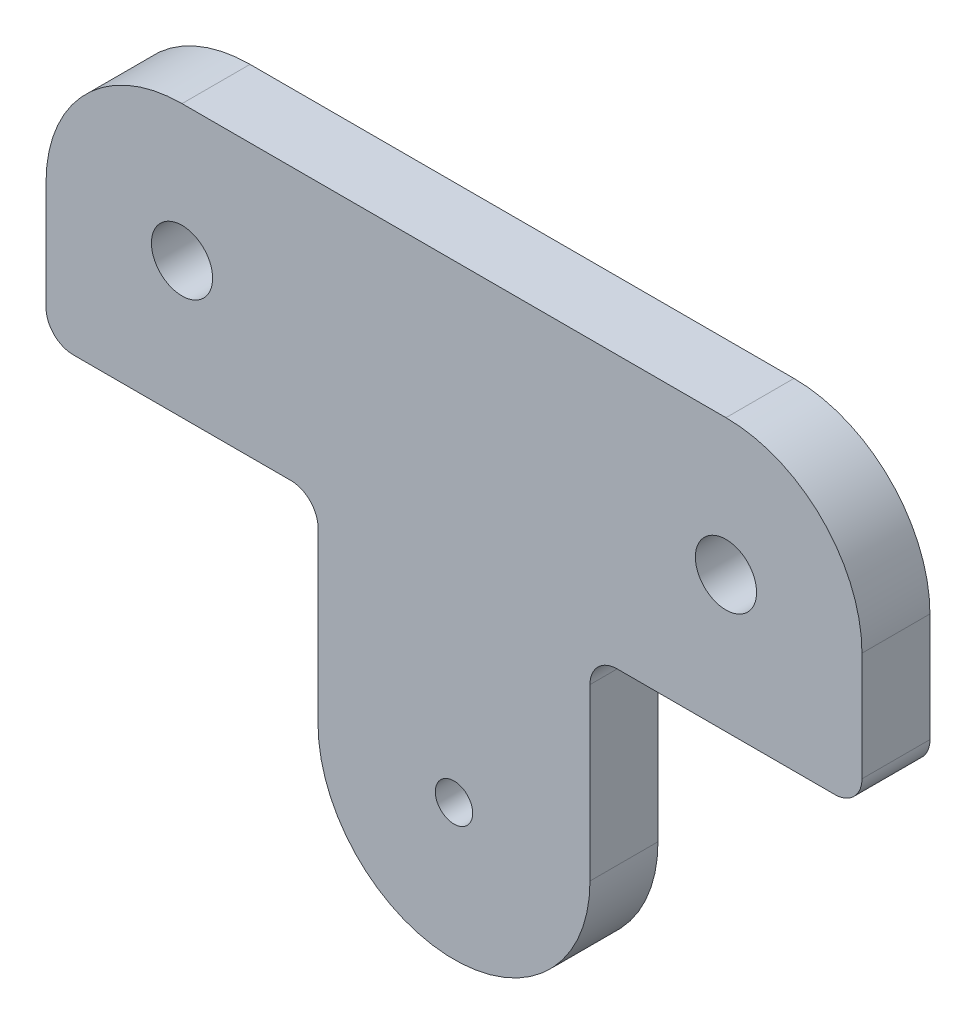
ISO-10303-21;
HEADER;
FILE_DESCRIPTION(('STEP AP214'),'2;1');
FILE_NAME('part.step','',(''),(''),'','','');
FILE_SCHEMA(('AUTOMOTIVE_DESIGN { 1 0 10303 214 1 1 1 1 }'));
ENDSEC;
DATA;
#1=APPLICATION_CONTEXT('core data for automotive mechanical design processes');
#2=APPLICATION_PROTOCOL_DEFINITION('international standard','automotive_design',2000,#1);
#3=PRODUCT_CONTEXT('',#1,'mechanical');
#4=PRODUCT('Part','Part','',(#3));
#5=PRODUCT_RELATED_PRODUCT_CATEGORY('part','',(#4));
#6=PRODUCT_DEFINITION_FORMATION('','',#4);
#7=PRODUCT_DEFINITION_CONTEXT('part definition',#1,'design');
#8=PRODUCT_DEFINITION('design','',#6,#7);
#9=PRODUCT_DEFINITION_SHAPE('','',#8);
#10=(LENGTH_UNIT() NAMED_UNIT(*) SI_UNIT(.MILLI.,.METRE.));
#11=(NAMED_UNIT(*) PLANE_ANGLE_UNIT() SI_UNIT($,.RADIAN.));
#12=(NAMED_UNIT(*) SI_UNIT($,.STERADIAN.) SOLID_ANGLE_UNIT());
#13=UNCERTAINTY_MEASURE_WITH_UNIT(LENGTH_MEASURE(1.E-05),#10,'distance_accuracy_value','');
#14=(GEOMETRIC_REPRESENTATION_CONTEXT(3) GLOBAL_UNCERTAINTY_ASSIGNED_CONTEXT((#13)) GLOBAL_UNIT_ASSIGNED_CONTEXT((#10,
#11,#12)) REPRESENTATION_CONTEXT('',''));
#15=CARTESIAN_POINT('',(0.,0.,0.));
#16=DIRECTION('',(0.,0.,1.));
#17=DIRECTION('',(1.,0.,0.));
#18=AXIS2_PLACEMENT_3D('',#15,#16,#17);
#19=CARTESIAN_POINT('',(26.9198066145719,-1.52399999999972,2.53999999999999));
#20=DIRECTION('',(0.,0.,-0.999999999999999));
#21=DIRECTION('',(-1.,0.,0.));
#22=AXIS2_PLACEMENT_3D('',#19,#20,#21);
#23=PLANE('',#22);
#24=CARTESIAN_POINT('',(26.9198066145719,-1.52399999999972,2.53999999999999));
#25=DIRECTION('',(0.,0.,0.999999999999999));
#26=DIRECTION('',(-1.,0.,0.));
#27=AXIS2_PLACEMENT_3D('',#24,#25,#26);
#28=CIRCLE('',#27,1.016);
#29=CARTESIAN_POINT('',(26.9198066145719,-2.53999999999971,2.53999999999993));
#30=VERTEX_POINT('',#29);
#31=CARTESIAN_POINT('',(27.9358066145719,-1.52399999999975,2.53999999999982));
#32=VERTEX_POINT('',#31);
#33=EDGE_CURVE('E198',#30,#32,#28,.T.);
#34=ORIENTED_EDGE('',*,*,#33,.T.);
#35=DIRECTION('',(0.,0.999999999999996,0.));
#36=VECTOR('',#35,1.);
#37=CARTESIAN_POINT('',(27.935806614572,2.54000000000032,2.5399999999999));
#38=LINE('',#37,#36);
#39=CARTESIAN_POINT('',(27.935806614572,2.54000000000032,2.5399999999999));
#40=VERTEX_POINT('',#39);
#41=EDGE_CURVE('E116',#32,#40,#38,.T.);
#42=ORIENTED_EDGE('',*,*,#41,.T.);
#43=CARTESIAN_POINT('',(22.8558066145719,2.54000000000026,2.53999999999999));
#44=DIRECTION('',(0.,0.,0.999999999999999));
#45=DIRECTION('',(-1.,0.,0.));
#46=AXIS2_PLACEMENT_3D('',#43,#44,#45);
#47=CIRCLE('',#46,5.08);
#48=CARTESIAN_POINT('',(22.8558066145719,7.62000000000029,2.53999999999996));
#49=VERTEX_POINT('',#48);
#50=EDGE_CURVE('E231',#40,#49,#47,.T.);
#51=ORIENTED_EDGE('',*,*,#50,.T.);
#52=DIRECTION('',(-1.,0.,0.));
#53=VECTOR('',#52,1.);
#54=CARTESIAN_POINT('',(2.53580661457181,7.62000000000029,2.54000000000007));
#55=LINE('',#54,#53);
#56=CARTESIAN_POINT('',(2.53580661457181,7.62000000000029,2.54000000000007));
#57=VERTEX_POINT('',#56);
#58=EDGE_CURVE('E250',#49,#57,#55,.T.);
#59=ORIENTED_EDGE('',*,*,#58,.T.);
#60=CARTESIAN_POINT('',(2.53580661457181,2.54000000000029,2.54000000000001));
#61=DIRECTION('',(0.,0.,0.999999999999999));
#62=DIRECTION('',(-1.,0.,0.));
#63=AXIS2_PLACEMENT_3D('',#60,#61,#62);
#64=CIRCLE('',#63,5.08);
#65=CARTESIAN_POINT('',(-2.54419338542822,2.54000000000026,2.53999999999999));
#66=VERTEX_POINT('',#65);
#67=EDGE_CURVE('E247',#57,#66,#64,.T.);
#68=ORIENTED_EDGE('',*,*,#67,.T.);
#69=DIRECTION('',(0.,-0.999999999999996,0.));
#70=VECTOR('',#69,1.);
#71=CARTESIAN_POINT('',(-2.54419338542822,2.54000000000026,2.53999999999999));
#72=LINE('',#71,#70);
#73=CARTESIAN_POINT('',(-2.54419338542826,-1.52399999999972,2.53999999999996));
#74=VERTEX_POINT('',#73);
#75=EDGE_CURVE('E249',#66,#74,#72,.T.);
#76=ORIENTED_EDGE('',*,*,#75,.T.);
#77=CARTESIAN_POINT('',(-1.52819338542826,-1.52399999999972,2.54000000000001));
#78=DIRECTION('',(0.,0.,0.999999999999999));
#79=DIRECTION('',(1.,0.,0.));
#80=AXIS2_PLACEMENT_3D('',#77,#78,#79);
#81=CIRCLE('',#80,1.016);
#82=CARTESIAN_POINT('',(-1.52819338542826,-2.53999999999993,2.54000000000013));
#83=VERTEX_POINT('',#82);
#84=EDGE_CURVE('E252',#74,#83,#81,.T.);
#85=ORIENTED_EDGE('',*,*,#84,.T.);
#86=DIRECTION('',(1.,0.,0.));
#87=VECTOR('',#86,1.);
#88=CARTESIAN_POINT('',(-1.52819338542826,-2.53999999999993,2.54000000000013));
#89=LINE('',#88,#87);
#90=CARTESIAN_POINT('',(6.59980661457166,-2.53999999999976,2.54000000000013));
#91=VERTEX_POINT('',#90);
#92=EDGE_CURVE('E258',#83,#91,#89,.T.);
#93=ORIENTED_EDGE('',*,*,#92,.T.);
#94=CARTESIAN_POINT('',(6.59980661457173,-3.55599999999973,2.54000000000013));
#95=DIRECTION('',(0.,0.,-0.999999999999999));
#96=DIRECTION('',(-1.,0.,0.));
#97=AXIS2_PLACEMENT_3D('',#94,#95,#96);
#98=CIRCLE('',#97,1.016);
#99=CARTESIAN_POINT('',(7.61580661457174,-3.55599999999981,2.53999999999993));
#100=VERTEX_POINT('',#99);
#101=EDGE_CURVE('E260',#91,#100,#98,.T.);
#102=ORIENTED_EDGE('',*,*,#101,.T.);
#103=DIRECTION('',(0.,-0.999999999999996,0.));
#104=VECTOR('',#103,1.);
#105=CARTESIAN_POINT('',(7.61580661457174,-3.55599999999981,2.53999999999993));
#106=LINE('',#105,#104);
#107=CARTESIAN_POINT('',(7.61580661457166,-9.90999999999961,2.54000000000007));
#108=VERTEX_POINT('',#107);
#109=EDGE_CURVE('E262',#100,#108,#106,.T.);
#110=ORIENTED_EDGE('',*,*,#109,.T.);
#111=CARTESIAN_POINT('',(12.6958066145717,-9.90999999999961,2.54000000000015));
#112=DIRECTION('',(0.,0.,0.999999999999999));
#113=DIRECTION('',(1.,0.,0.));
#114=AXIS2_PLACEMENT_3D('',#111,#112,#113);
#115=CIRCLE('',#114,5.08);
#116=CARTESIAN_POINT('',(17.7758066145717,-9.90999999999939,2.53999999999999));
#117=VERTEX_POINT('',#116);
#118=EDGE_CURVE('E153',#108,#117,#115,.T.);
#119=ORIENTED_EDGE('',*,*,#118,.T.);
#120=DIRECTION('',(0.,0.999999999999996,0.));
#121=VECTOR('',#120,1.);
#122=CARTESIAN_POINT('',(17.7758066145717,-3.55599999999973,2.5400000000001));
#123=LINE('',#122,#121);
#124=CARTESIAN_POINT('',(17.7758066145717,-3.55599999999973,2.5400000000001));
#125=VERTEX_POINT('',#124);
#126=EDGE_CURVE('E147',#117,#125,#123,.T.);
#127=ORIENTED_EDGE('',*,*,#126,.T.);
#128=CARTESIAN_POINT('',(18.7918066145717,-3.55599999999973,2.54000000000015));
#129=DIRECTION('',(0.,0.,-0.999999999999999));
#130=DIRECTION('',(1.,0.,0.));
#131=AXIS2_PLACEMENT_3D('',#128,#129,#130);
#132=CIRCLE('',#131,1.016);
#133=CARTESIAN_POINT('',(18.7918066145717,-2.53999999999985,2.54000000000013));
#134=VERTEX_POINT('',#133);
#135=EDGE_CURVE('E151',#125,#134,#132,.T.);
#136=ORIENTED_EDGE('',*,*,#135,.T.);
#137=DIRECTION('',(1.,0.,0.));
#138=VECTOR('',#137,1.);
#139=CARTESIAN_POINT('',(26.9198066145719,-2.53999999999971,2.53999999999993));
#140=LINE('',#139,#138);
#141=EDGE_CURVE('E55',#134,#30,#140,.T.);
#142=ORIENTED_EDGE('',*,*,#141,.T.);
#143=EDGE_LOOP('',(#34,#42,#51,#59,#68,#76,#85,#93,#102,#110,#119,#127,#136,#142));
#144=FACE_BOUND('',#143,.T.);
#145=CARTESIAN_POINT('',(2.53580661457181,2.54000000000029,2.54000000000001));
#146=DIRECTION('',(0.,0.,0.999999999999999));
#147=DIRECTION('',(1.,0.,0.));
#148=AXIS2_PLACEMENT_3D('',#145,#146,#147);
#149=CIRCLE('',#148,1.143);
#150=CARTESIAN_POINT('',(1.39280661457181,2.54000000000029,2.54000000000001));
#151=VERTEX_POINT('',#150);
#152=EDGE_CURVE('E175',#151,#151,#149,.T.);
#153=ORIENTED_EDGE('',*,*,#152,.F.);
#154=EDGE_LOOP('',(#153));
#155=FACE_BOUND('',#154,.T.);
#156=CARTESIAN_POINT('',(12.6958066145717,-9.90999999999961,2.54000000000015));
#157=DIRECTION('',(0.,0.,0.999999999999999));
#158=DIRECTION('',(1.,0.,0.));
#159=AXIS2_PLACEMENT_3D('',#156,#157,#158);
#160=CIRCLE('',#159,0.698499999999999);
#161=CARTESIAN_POINT('',(11.9973066145717,-9.90999999999961,2.54000000000015));
#162=VERTEX_POINT('',#161);
#163=EDGE_CURVE('E316',#162,#162,#160,.T.);
#164=ORIENTED_EDGE('',*,*,#163,.F.);
#165=EDGE_LOOP('',(#164));
#166=FACE_BOUND('',#165,.T.);
#167=CARTESIAN_POINT('',(22.8558066145719,2.54000000000026,2.53999999999999));
#168=DIRECTION('',(0.,0.,0.999999999999999));
#169=DIRECTION('',(1.,0.,0.));
#170=AXIS2_PLACEMENT_3D('',#167,#168,#169);
#171=CIRCLE('',#170,1.14299999999999);
#172=CARTESIAN_POINT('',(21.7128066145719,2.54000000000026,2.53999999999999));
#173=VERTEX_POINT('',#172);
#174=EDGE_CURVE('E307',#173,#173,#171,.T.);
#175=ORIENTED_EDGE('',*,*,#174,.F.);
#176=EDGE_LOOP('',(#175));
#177=FACE_BOUND('',#176,.T.);
#178=ADVANCED_FACE('F38',(#144,#155,#166,#177),#23,.F.);
#179=CARTESIAN_POINT('',(26.9198066145719,-1.52399999999972,0.));
#180=DIRECTION('',(0.,0.,-0.999999999999999));
#181=DIRECTION('',(-1.,0.,0.));
#182=AXIS2_PLACEMENT_3D('',#179,#180,#181);
#183=PLANE('',#182);
#184=CARTESIAN_POINT('',(12.6958066145717,-9.90999999999959,1.11022302462516E-13));
#185=DIRECTION('',(0.,0.,0.999999999999999));
#186=DIRECTION('',(1.,0.,0.));
#187=AXIS2_PLACEMENT_3D('',#184,#185,#186);
#188=CIRCLE('',#187,0.698499999999999);
#189=CARTESIAN_POINT('',(11.9973066145717,-9.90999999999961,1.1145598333151E-13));
#190=VERTEX_POINT('',#189);
#191=EDGE_CURVE('E313',#190,#190,#188,.T.);
#192=ORIENTED_EDGE('',*,*,#191,.T.);
#193=EDGE_LOOP('',(#192));
#194=FACE_BOUND('',#193,.T.);
#195=CARTESIAN_POINT('',(26.9198066145719,-1.52399999999972,0.));
#196=DIRECTION('',(0.,0.,0.999999999999999));
#197=DIRECTION('',(-1.,0.,0.));
#198=AXIS2_PLACEMENT_3D('',#195,#196,#197);
#199=CIRCLE('',#198,1.016);
#200=CARTESIAN_POINT('',(26.9198066145719,-2.53999999999996,1.38777878078145E-13));
#201=VERTEX_POINT('',#200);
#202=CARTESIAN_POINT('',(27.9358066145719,-1.52399999999972,0.));
#203=VERTEX_POINT('',#202);
#204=EDGE_CURVE('E171',#201,#203,#199,.T.);
#205=ORIENTED_EDGE('',*,*,#204,.F.);
#206=DIRECTION('',(1.,0.,0.));
#207=VECTOR('',#206,1.);
#208=CARTESIAN_POINT('',(26.9198066145719,-2.53999999999996,1.38777878078145E-13));
#209=LINE('',#208,#207);
#210=CARTESIAN_POINT('',(18.7918066145717,-2.53999999999982,1.11022302462516E-13));
#211=VERTEX_POINT('',#210);
#212=EDGE_CURVE('E108',#211,#201,#209,.T.);
#213=ORIENTED_EDGE('',*,*,#212,.F.);
#214=CARTESIAN_POINT('',(18.7918066145717,-3.55599999999973,1.11022302462516E-13));
#215=DIRECTION('',(0.,0.,-0.999999999999999));
#216=DIRECTION('',(1.,0.,0.));
#217=AXIS2_PLACEMENT_3D('',#214,#215,#216);
#218=CIRCLE('',#217,1.016);
#219=CARTESIAN_POINT('',(17.7758066145717,-3.55599999999973,0.));
#220=VERTEX_POINT('',#219);
#221=EDGE_CURVE('E102',#220,#211,#218,.T.);
#222=ORIENTED_EDGE('',*,*,#221,.F.);
#223=DIRECTION('',(0.,0.999999999999996,0.));
#224=VECTOR('',#223,1.);
#225=CARTESIAN_POINT('',(17.7758066145717,-3.55599999999973,0.));
#226=LINE('',#225,#224);
#227=CARTESIAN_POINT('',(17.7758066145717,-9.90999999999964,0.));
#228=VERTEX_POINT('',#227);
#229=EDGE_CURVE('E161',#228,#220,#226,.T.);
#230=ORIENTED_EDGE('',*,*,#229,.F.);
#231=CARTESIAN_POINT('',(12.6958066145717,-9.90999999999959,1.11022302462516E-13));
#232=DIRECTION('',(0.,0.,0.999999999999999));
#233=DIRECTION('',(1.,0.,0.));
#234=AXIS2_PLACEMENT_3D('',#231,#232,#233);
#235=CIRCLE('',#234,5.08);
#236=CARTESIAN_POINT('',(7.6158066145717,-9.90999999999967,0.));
#237=VERTEX_POINT('',#236);
#238=EDGE_CURVE('E193',#237,#228,#235,.T.);
#239=ORIENTED_EDGE('',*,*,#238,.F.);
#240=DIRECTION('',(0.,-0.999999999999996,0.));
#241=VECTOR('',#240,1.);
#242=CARTESIAN_POINT('',(7.6158066145717,-3.55599999999973,0.));
#243=LINE('',#242,#241);
#244=CARTESIAN_POINT('',(7.6158066145717,-3.55599999999973,0.));
#245=VERTEX_POINT('',#244);
#246=EDGE_CURVE('E191',#245,#237,#243,.T.);
#247=ORIENTED_EDGE('',*,*,#246,.F.);
#248=CARTESIAN_POINT('',(6.5998066145717,-3.55599999999973,0.));
#249=DIRECTION('',(0.,0.,-0.999999999999999));
#250=DIRECTION('',(-1.,0.,0.));
#251=AXIS2_PLACEMENT_3D('',#248,#249,#250);
#252=CIRCLE('',#251,1.016);
#253=CARTESIAN_POINT('',(6.5998066145717,-2.53999999999971,0.));
#254=VERTEX_POINT('',#253);
#255=EDGE_CURVE('E189',#254,#245,#252,.T.);
#256=ORIENTED_EDGE('',*,*,#255,.F.);
#257=DIRECTION('',(1.,0.,0.));
#258=VECTOR('',#257,1.);
#259=CARTESIAN_POINT('',(-1.52819338542828,-2.53999999999946,0.));
#260=LINE('',#259,#258);
#261=CARTESIAN_POINT('',(-1.52819338542828,-2.53999999999946,0.));
#262=VERTEX_POINT('',#261);
#263=EDGE_CURVE('E187',#262,#254,#260,.T.);
#264=ORIENTED_EDGE('',*,*,#263,.F.);
#265=CARTESIAN_POINT('',(-1.52819338542826,-1.52399999999986,1.38777878078145E-13));
#266=DIRECTION('',(0.,0.,0.999999999999999));
#267=DIRECTION('',(1.,0.,0.));
#268=AXIS2_PLACEMENT_3D('',#265,#266,#267);
#269=CIRCLE('',#268,1.016);
#270=CARTESIAN_POINT('',(-2.54419338542825,-1.5239999999998,0.));
#271=VERTEX_POINT('',#270);
#272=EDGE_CURVE('E185',#271,#262,#269,.T.);
#273=ORIENTED_EDGE('',*,*,#272,.F.);
#274=DIRECTION('',(0.,-0.999999999999996,0.));
#275=VECTOR('',#274,1.);
#276=CARTESIAN_POINT('',(-2.54419338542825,2.54000000000026,1.11022302462516E-13));
#277=LINE('',#276,#275);
#278=CARTESIAN_POINT('',(-2.54419338542825,2.54000000000026,1.11022302462516E-13));
#279=VERTEX_POINT('',#278);
#280=EDGE_CURVE('E183',#279,#271,#277,.T.);
#281=ORIENTED_EDGE('',*,*,#280,.F.);
#282=CARTESIAN_POINT('',(2.53580661457182,2.5400000000001,-1.38777878078145E-13));
#283=DIRECTION('',(0.,0.,0.999999999999999));
#284=DIRECTION('',(-1.,0.,0.));
#285=AXIS2_PLACEMENT_3D('',#282,#283,#284);
#286=CIRCLE('',#285,5.08);
#287=CARTESIAN_POINT('',(2.53580661457178,7.62000000000002,0.));
#288=VERTEX_POINT('',#287);
#289=EDGE_CURVE('E181',#288,#279,#286,.T.);
#290=ORIENTED_EDGE('',*,*,#289,.F.);
#291=DIRECTION('',(-1.,0.,0.));
#292=VECTOR('',#291,1.);
#293=CARTESIAN_POINT('',(2.53580661457178,7.62000000000002,0.));
#294=LINE('',#293,#292);
#295=CARTESIAN_POINT('',(22.8558066145719,7.62000000000028,0.));
#296=VERTEX_POINT('',#295);
#297=EDGE_CURVE('E179',#296,#288,#294,.T.);
#298=ORIENTED_EDGE('',*,*,#297,.F.);
#299=CARTESIAN_POINT('',(22.8558066145719,2.54000000000004,-1.38777878078145E-13));
#300=DIRECTION('',(0.,0.,0.999999999999999));
#301=DIRECTION('',(-1.,0.,0.));
#302=AXIS2_PLACEMENT_3D('',#299,#300,#301);
#303=CIRCLE('',#302,5.08);
#304=CARTESIAN_POINT('',(27.9358066145719,2.54000000000024,-1.11022302462516E-13));
#305=VERTEX_POINT('',#304);
#306=EDGE_CURVE('E177',#305,#296,#303,.T.);
#307=ORIENTED_EDGE('',*,*,#306,.F.);
#308=DIRECTION('',(0.,0.999999999999996,0.));
#309=VECTOR('',#308,1.);
#310=CARTESIAN_POINT('',(27.9358066145719,2.54000000000024,-1.11022302462516E-13));
#311=LINE('',#310,#309);
#312=EDGE_CURVE('E174',#203,#305,#311,.T.);
#313=ORIENTED_EDGE('',*,*,#312,.F.);
#314=EDGE_LOOP('',(#205,#213,#222,#230,#239,#247,#256,#264,#273,#281,#290,#298,#307,#313));
#315=FACE_BOUND('',#314,.T.);
#316=CARTESIAN_POINT('',(2.53580661457182,2.5400000000001,-1.38777878078145E-13));
#317=DIRECTION('',(0.,0.,0.999999999999999));
#318=DIRECTION('',(1.,0.,0.));
#319=AXIS2_PLACEMENT_3D('',#316,#317,#318);
#320=CIRCLE('',#319,1.143);
#321=CARTESIAN_POINT('',(1.39280661457181,2.54000000000029,-1.3834419720915E-13));
#322=VERTEX_POINT('',#321);
#323=EDGE_CURVE('E319',#322,#322,#320,.T.);
#324=ORIENTED_EDGE('',*,*,#323,.T.);
#325=EDGE_LOOP('',(#324));
#326=FACE_BOUND('',#325,.T.);
#327=CARTESIAN_POINT('',(22.8558066145719,2.54000000000004,-1.38777878078145E-13));
#328=DIRECTION('',(0.,0.,0.999999999999999));
#329=DIRECTION('',(1.,0.,0.));
#330=AXIS2_PLACEMENT_3D('',#327,#328,#329);
#331=CIRCLE('',#330,1.14299999999999);
#332=CARTESIAN_POINT('',(21.7128066145719,2.54000000000026,-1.3834419720915E-13));
#333=VERTEX_POINT('',#332);
#334=EDGE_CURVE('E310',#333,#333,#331,.T.);
#335=ORIENTED_EDGE('',*,*,#334,.T.);
#336=EDGE_LOOP('',(#335));
#337=FACE_BOUND('',#336,.T.);
#338=ADVANCED_FACE('F235',(#194,#315,#326,#337),#183,.T.);
#339=CARTESIAN_POINT('',(26.9198066145719,-1.52399999999972,2.53999999999999));
#340=DIRECTION('',(0.,0.,-0.999999999999999));
#341=DIRECTION('',(-1.,0.,0.));
#342=AXIS2_PLACEMENT_3D('',#339,#340,#341);
#343=CYLINDRICAL_SURFACE('',#342,1.016);
#344=ORIENTED_EDGE('',*,*,#204,.T.);
#345=DIRECTION('',(0.,0.,-0.999999999999999));
#346=VECTOR('',#345,1.);
#347=CARTESIAN_POINT('',(27.9358066145719,-1.52399999999975,2.53999999999982));
#348=LINE('',#347,#346);
#349=EDGE_CURVE('E11',#32,#203,#348,.T.);
#350=ORIENTED_EDGE('',*,*,#349,.F.);
#351=ORIENTED_EDGE('',*,*,#33,.F.);
#352=DIRECTION('',(0.,0.,-0.999999999999999));
#353=VECTOR('',#352,1.);
#354=CARTESIAN_POINT('',(26.9198066145719,-2.53999999999971,2.53999999999993));
#355=LINE('',#354,#353);
#356=EDGE_CURVE('E167',#30,#201,#355,.T.);
#357=ORIENTED_EDGE('',*,*,#356,.T.);
#358=EDGE_LOOP('',(#344,#350,#351,#357));
#359=FACE_BOUND('',#358,.T.);
#360=ADVANCED_FACE('F40',(#359),#343,.T.);
#361=CARTESIAN_POINT('',(27.935806614572,2.54000000000032,2.5399999999999));
#362=DIRECTION('',(-1.,0.,0.));
#363=DIRECTION('',(0.,-0.999999999999996,0.));
#364=AXIS2_PLACEMENT_3D('',#361,#362,#363);
#365=PLANE('',#364);
#366=ORIENTED_EDGE('',*,*,#312,.T.);
#367=DIRECTION('',(0.,0.,-0.999999999999999));
#368=VECTOR('',#367,1.);
#369=CARTESIAN_POINT('',(27.935806614572,2.54000000000032,2.5399999999999));
#370=LINE('',#369,#368);
#371=EDGE_CURVE('E47',#40,#305,#370,.T.);
#372=ORIENTED_EDGE('',*,*,#371,.F.);
#373=ORIENTED_EDGE('',*,*,#41,.F.);
#374=ORIENTED_EDGE('',*,*,#349,.T.);
#375=EDGE_LOOP('',(#366,#372,#373,#374));
#376=FACE_BOUND('',#375,.T.);
#377=ADVANCED_FACE('F442',(#376),#365,.F.);
#378=CARTESIAN_POINT('',(22.8558066145719,2.54000000000026,2.53999999999999));
#379=DIRECTION('',(0.,0.,-0.999999999999999));
#380=DIRECTION('',(-1.,0.,0.));
#381=AXIS2_PLACEMENT_3D('',#378,#379,#380);
#382=CYLINDRICAL_SURFACE('',#381,5.08);
#383=ORIENTED_EDGE('',*,*,#306,.T.);
#384=DIRECTION('',(0.,0.,-0.999999999999999));
#385=VECTOR('',#384,1.);
#386=CARTESIAN_POINT('',(22.8558066145719,7.62000000000029,2.53999999999996));
#387=LINE('',#386,#385);
#388=EDGE_CURVE('E223',#49,#296,#387,.T.);
#389=ORIENTED_EDGE('',*,*,#388,.F.);
#390=ORIENTED_EDGE('',*,*,#50,.F.);
#391=ORIENTED_EDGE('',*,*,#371,.T.);
#392=EDGE_LOOP('',(#383,#389,#390,#391));
#393=FACE_BOUND('',#392,.T.);
#394=ADVANCED_FACE('F229',(#393),#382,.T.);
#395=CARTESIAN_POINT('',(2.53580661457181,7.62000000000029,2.54000000000007));
#396=DIRECTION('',(0.,-0.999999999999996,0.));
#397=DIRECTION('',(0.,0.,-0.999999999999999));
#398=AXIS2_PLACEMENT_3D('',#395,#396,#397);
#399=PLANE('',#398);
#400=ORIENTED_EDGE('',*,*,#297,.T.);
#401=DIRECTION('',(0.,0.,-0.999999999999999));
#402=VECTOR('',#401,1.);
#403=CARTESIAN_POINT('',(2.53580661457181,7.62000000000029,2.54000000000007));
#404=LINE('',#403,#402);
#405=EDGE_CURVE('E220',#57,#288,#404,.T.);
#406=ORIENTED_EDGE('',*,*,#405,.F.);
#407=ORIENTED_EDGE('',*,*,#58,.F.);
#408=ORIENTED_EDGE('',*,*,#388,.T.);
#409=EDGE_LOOP('',(#400,#406,#407,#408));
#410=FACE_BOUND('',#409,.T.);
#411=ADVANCED_FACE('F241',(#410),#399,.F.);
#412=CARTESIAN_POINT('',(2.53580661457181,2.54000000000029,2.54000000000001));
#413=DIRECTION('',(0.,0.,-0.999999999999999));
#414=DIRECTION('',(-1.,0.,0.));
#415=AXIS2_PLACEMENT_3D('',#412,#413,#414);
#416=CYLINDRICAL_SURFACE('',#415,5.08);
#417=ORIENTED_EDGE('',*,*,#289,.T.);
#418=DIRECTION('',(0.,0.,-0.999999999999999));
#419=VECTOR('',#418,1.);
#420=CARTESIAN_POINT('',(-2.54419338542822,2.54000000000026,2.53999999999999));
#421=LINE('',#420,#419);
#422=EDGE_CURVE('E217',#66,#279,#421,.T.);
#423=ORIENTED_EDGE('',*,*,#422,.F.);
#424=ORIENTED_EDGE('',*,*,#67,.F.);
#425=ORIENTED_EDGE('',*,*,#405,.T.);
#426=EDGE_LOOP('',(#417,#423,#424,#425));
#427=FACE_BOUND('',#426,.T.);
#428=ADVANCED_FACE('F245',(#427),#416,.T.);
#429=CARTESIAN_POINT('',(-2.54419338542822,2.54000000000026,2.53999999999999));
#430=DIRECTION('',(1.,0.,0.));
#431=DIRECTION('',(0.,0.,-0.999999999999999));
#432=AXIS2_PLACEMENT_3D('',#429,#430,#431);
#433=PLANE('',#432);
#434=ORIENTED_EDGE('',*,*,#280,.T.);
#435=DIRECTION('',(0.,0.,-0.999999999999999));
#436=VECTOR('',#435,1.);
#437=CARTESIAN_POINT('',(-2.54419338542826,-1.52399999999972,2.53999999999996));
#438=LINE('',#437,#436);
#439=EDGE_CURVE('E214',#74,#271,#438,.T.);
#440=ORIENTED_EDGE('',*,*,#439,.F.);
#441=ORIENTED_EDGE('',*,*,#75,.F.);
#442=ORIENTED_EDGE('',*,*,#422,.T.);
#443=EDGE_LOOP('',(#434,#440,#441,#442));
#444=FACE_BOUND('',#443,.T.);
#445=ADVANCED_FACE('F407',(#444),#433,.F.);
#446=CARTESIAN_POINT('',(-1.52819338542826,-1.52399999999972,2.54000000000001));
#447=DIRECTION('',(0.,0.,-0.999999999999999));
#448=DIRECTION('',(-1.,0.,0.));
#449=AXIS2_PLACEMENT_3D('',#446,#447,#448);
#450=CYLINDRICAL_SURFACE('',#449,1.016);
#451=ORIENTED_EDGE('',*,*,#272,.T.);
#452=DIRECTION('',(0.,0.,-0.999999999999999));
#453=VECTOR('',#452,1.);
#454=CARTESIAN_POINT('',(-1.52819338542826,-2.53999999999993,2.54000000000013));
#455=LINE('',#454,#453);
#456=EDGE_CURVE('E211',#83,#262,#455,.T.);
#457=ORIENTED_EDGE('',*,*,#456,.F.);
#458=ORIENTED_EDGE('',*,*,#84,.F.);
#459=ORIENTED_EDGE('',*,*,#439,.T.);
#460=EDGE_LOOP('',(#451,#457,#458,#459));
#461=FACE_BOUND('',#460,.T.);
#462=ADVANCED_FACE('F397',(#461),#450,.T.);
#463=CARTESIAN_POINT('',(-1.52819338542826,-2.53999999999993,2.54000000000013));
#464=DIRECTION('',(0.,0.999999999999996,0.));
#465=DIRECTION('',(-1.,0.,0.));
#466=AXIS2_PLACEMENT_3D('',#463,#464,#465);
#467=PLANE('',#466);
#468=ORIENTED_EDGE('',*,*,#263,.T.);
#469=DIRECTION('',(0.,0.,-0.999999999999999));
#470=VECTOR('',#469,1.);
#471=CARTESIAN_POINT('',(6.59980661457166,-2.53999999999976,2.54000000000013));
#472=LINE('',#471,#470);
#473=EDGE_CURVE('E208',#91,#254,#472,.T.);
#474=ORIENTED_EDGE('',*,*,#473,.F.);
#475=ORIENTED_EDGE('',*,*,#92,.F.);
#476=ORIENTED_EDGE('',*,*,#456,.T.);
#477=EDGE_LOOP('',(#468,#474,#475,#476));
#478=FACE_BOUND('',#477,.T.);
#479=ADVANCED_FACE('F387',(#478),#467,.F.);
#480=CARTESIAN_POINT('',(6.59980661457173,-3.55599999999973,2.54000000000013));
#481=DIRECTION('',(0.,0.,-0.999999999999999));
#482=DIRECTION('',(-1.,0.,0.));
#483=AXIS2_PLACEMENT_3D('',#480,#481,#482);
#484=CYLINDRICAL_SURFACE('',#483,1.016);
#485=ORIENTED_EDGE('',*,*,#255,.T.);
#486=DIRECTION('',(0.,0.,-0.999999999999999));
#487=VECTOR('',#486,1.);
#488=CARTESIAN_POINT('',(7.61580661457174,-3.55599999999981,2.53999999999993));
#489=LINE('',#488,#487);
#490=EDGE_CURVE('E205',#100,#245,#489,.T.);
#491=ORIENTED_EDGE('',*,*,#490,.F.);
#492=ORIENTED_EDGE('',*,*,#101,.F.);
#493=ORIENTED_EDGE('',*,*,#473,.T.);
#494=EDGE_LOOP('',(#485,#491,#492,#493));
#495=FACE_BOUND('',#494,.T.);
#496=ADVANCED_FACE('F378',(#495),#484,.F.);
#497=CARTESIAN_POINT('',(7.61580661457174,-3.55599999999981,2.53999999999993));
#498=DIRECTION('',(1.,0.,0.));
#499=DIRECTION('',(0.,0.999999999999996,0.));
#500=AXIS2_PLACEMENT_3D('',#497,#498,#499);
#501=PLANE('',#500);
#502=ORIENTED_EDGE('',*,*,#246,.T.);
#503=DIRECTION('',(0.,0.,-0.999999999999999));
#504=VECTOR('',#503,1.);
#505=CARTESIAN_POINT('',(7.61580661457166,-9.90999999999961,2.54000000000007));
#506=LINE('',#505,#504);
#507=EDGE_CURVE('E202',#108,#237,#506,.T.);
#508=ORIENTED_EDGE('',*,*,#507,.F.);
#509=ORIENTED_EDGE('',*,*,#109,.F.);
#510=ORIENTED_EDGE('',*,*,#490,.T.);
#511=EDGE_LOOP('',(#502,#508,#509,#510));
#512=FACE_BOUND('',#511,.T.);
#513=ADVANCED_FACE('F268',(#512),#501,.F.);
#514=CARTESIAN_POINT('',(12.6958066145717,-9.90999999999961,2.54000000000015));
#515=DIRECTION('',(0.,0.,-0.999999999999999));
#516=DIRECTION('',(-1.,0.,0.));
#517=AXIS2_PLACEMENT_3D('',#514,#515,#516);
#518=CYLINDRICAL_SURFACE('',#517,5.08);
#519=ORIENTED_EDGE('',*,*,#238,.T.);
#520=DIRECTION('',(0.,0.,-0.999999999999999));
#521=VECTOR('',#520,1.);
#522=CARTESIAN_POINT('',(17.7758066145717,-9.90999999999939,2.53999999999999));
#523=LINE('',#522,#521);
#524=EDGE_CURVE('E162',#117,#228,#523,.T.);
#525=ORIENTED_EDGE('',*,*,#524,.F.);
#526=ORIENTED_EDGE('',*,*,#118,.F.);
#527=ORIENTED_EDGE('',*,*,#507,.T.);
#528=EDGE_LOOP('',(#519,#525,#526,#527));
#529=FACE_BOUND('',#528,.T.);
#530=ADVANCED_FACE('F272',(#529),#518,.T.);
#531=CARTESIAN_POINT('',(17.7758066145717,-3.55599999999973,2.5400000000001));
#532=DIRECTION('',(-1.,0.,0.));
#533=DIRECTION('',(0.,-0.999999999999996,0.));
#534=AXIS2_PLACEMENT_3D('',#531,#532,#533);
#535=PLANE('',#534);
#536=ORIENTED_EDGE('',*,*,#229,.T.);
#537=DIRECTION('',(0.,0.,-0.999999999999999));
#538=VECTOR('',#537,1.);
#539=CARTESIAN_POINT('',(17.7758066145717,-3.55599999999973,2.5400000000001));
#540=LINE('',#539,#538);
#541=EDGE_CURVE('E158',#125,#220,#540,.T.);
#542=ORIENTED_EDGE('',*,*,#541,.F.);
#543=ORIENTED_EDGE('',*,*,#126,.F.);
#544=ORIENTED_EDGE('',*,*,#524,.T.);
#545=EDGE_LOOP('',(#536,#542,#543,#544));
#546=FACE_BOUND('',#545,.T.);
#547=ADVANCED_FACE('F159',(#546),#535,.F.);
#548=CARTESIAN_POINT('',(18.7918066145717,-3.55599999999973,2.54000000000015));
#549=DIRECTION('',(0.,0.,-0.999999999999999));
#550=DIRECTION('',(-1.,0.,0.));
#551=AXIS2_PLACEMENT_3D('',#548,#549,#550);
#552=CYLINDRICAL_SURFACE('',#551,1.016);
#553=ORIENTED_EDGE('',*,*,#221,.T.);
#554=DIRECTION('',(0.,0.,-0.999999999999999));
#555=VECTOR('',#554,1.);
#556=CARTESIAN_POINT('',(18.7918066145717,-2.53999999999985,2.54000000000013));
#557=LINE('',#556,#555);
#558=EDGE_CURVE('E163',#134,#211,#557,.T.);
#559=ORIENTED_EDGE('',*,*,#558,.F.);
#560=ORIENTED_EDGE('',*,*,#135,.F.);
#561=ORIENTED_EDGE('',*,*,#541,.T.);
#562=EDGE_LOOP('',(#553,#559,#560,#561));
#563=FACE_BOUND('',#562,.T.);
#564=ADVANCED_FACE('F165',(#563),#552,.F.);
#565=CARTESIAN_POINT('',(26.9198066145719,-2.53999999999971,2.53999999999993));
#566=DIRECTION('',(0.,0.999999999999996,0.));
#567=DIRECTION('',(-1.,0.,0.));
#568=AXIS2_PLACEMENT_3D('',#565,#566,#567);
#569=PLANE('',#568);
#570=ORIENTED_EDGE('',*,*,#212,.T.);
#571=ORIENTED_EDGE('',*,*,#356,.F.);
#572=ORIENTED_EDGE('',*,*,#141,.F.);
#573=ORIENTED_EDGE('',*,*,#558,.T.);
#574=EDGE_LOOP('',(#570,#571,#572,#573));
#575=FACE_BOUND('',#574,.T.);
#576=ADVANCED_FACE('F276',(#575),#569,.F.);
#577=CARTESIAN_POINT('',(2.53580661457181,2.54000000000029,2.54000000000001));
#578=DIRECTION('',(0.,0.,-0.999999999999999));
#579=DIRECTION('',(-1.,0.,0.));
#580=AXIS2_PLACEMENT_3D('',#577,#578,#579);
#581=CYLINDRICAL_SURFACE('',#580,1.143);
#582=CARTESIAN_POINT('',(1.39280661457181,2.54000000000029,2.54000000000001));
#583=CARTESIAN_POINT('',(1.39280661457181,2.54000000000029,2.51354166666668));
#584=CARTESIAN_POINT('',(1.39280661457181,2.54000000000029,2.48708333333334));
#585=CARTESIAN_POINT('',(1.39280661457181,2.54000000000029,2.43416666666667));
#586=CARTESIAN_POINT('',(1.39280661457181,2.54000000000029,2.40770833333334));
#587=CARTESIAN_POINT('',(1.39280661457181,2.54000000000029,2.35479166666667));
#588=CARTESIAN_POINT('',(1.39280661457181,2.54000000000029,2.32833333333334));
#589=CARTESIAN_POINT('',(1.39280661457181,2.54000000000029,2.27541666666667));
#590=CARTESIAN_POINT('',(1.39280661457181,2.54000000000029,2.24895833333333));
#591=CARTESIAN_POINT('',(1.39280661457181,2.54000000000029,2.19604166666666));
#592=CARTESIAN_POINT('',(1.39280661457181,2.54000000000029,2.16958333333333));
#593=CARTESIAN_POINT('',(1.39280661457181,2.54000000000029,2.11666666666666));
#594=CARTESIAN_POINT('',(1.39280661457181,2.54000000000029,2.09020833333332));
#595=CARTESIAN_POINT('',(1.39280661457181,2.54000000000029,2.03729166666665));
#596=CARTESIAN_POINT('',(1.39280661457181,2.54000000000029,2.01083333333332));
#597=CARTESIAN_POINT('',(1.39280661457181,2.54000000000029,1.95791666666665));
#598=CARTESIAN_POINT('',(1.39280661457181,2.54000000000029,1.93145833333331));
#599=CARTESIAN_POINT('',(1.39280661457181,2.54000000000029,1.87854166666664));
#600=CARTESIAN_POINT('',(1.39280661457181,2.54000000000029,1.85208333333331));
#601=CARTESIAN_POINT('',(1.39280661457181,2.54000000000029,1.79916666666664));
#602=CARTESIAN_POINT('',(1.39280661457181,2.54000000000029,1.7727083333333));
#603=CARTESIAN_POINT('',(1.39280661457181,2.54000000000029,1.71979166666663));
#604=CARTESIAN_POINT('',(1.39280661457181,2.54000000000029,1.6933333333333));
#605=CARTESIAN_POINT('',(1.39280661457181,2.54000000000029,1.64041666666663));
#606=CARTESIAN_POINT('',(1.39280661457181,2.54000000000029,1.61395833333329));
#607=CARTESIAN_POINT('',(1.39280661457181,2.54000000000029,1.56104166666662));
#608=CARTESIAN_POINT('',(1.39280661457181,2.54000000000029,1.53458333333329));
#609=CARTESIAN_POINT('',(1.39280661457181,2.54000000000029,1.48166666666662));
#610=CARTESIAN_POINT('',(1.39280661457181,2.54000000000029,1.45520833333328));
#611=CARTESIAN_POINT('',(1.39280661457181,2.54000000000029,1.40229166666661));
#612=CARTESIAN_POINT('',(1.39280661457181,2.54000000000029,1.37583333333328));
#613=CARTESIAN_POINT('',(1.39280661457181,2.54000000000029,1.32291666666661));
#614=CARTESIAN_POINT('',(1.39280661457181,2.54000000000029,1.29645833333327));
#615=CARTESIAN_POINT('',(1.39280661457181,2.54000000000029,1.2435416666666));
#616=CARTESIAN_POINT('',(1.39280661457181,2.54000000000029,1.21708333333327));
#617=CARTESIAN_POINT('',(1.39280661457181,2.54000000000029,1.1641666666666));
#618=CARTESIAN_POINT('',(1.39280661457181,2.54000000000029,1.13770833333326));
#619=CARTESIAN_POINT('',(1.39280661457181,2.54000000000029,1.08479166666659));
#620=CARTESIAN_POINT('',(1.39280661457181,2.54000000000029,1.05833333333326));
#621=CARTESIAN_POINT('',(1.39280661457181,2.54000000000029,1.00541666666659));
#622=CARTESIAN_POINT('',(1.39280661457181,2.54000000000029,0.978958333333254));
#623=CARTESIAN_POINT('',(1.39280661457181,2.54000000000029,0.926041666666584));
#624=CARTESIAN_POINT('',(1.39280661457181,2.54000000000029,0.899583333333249));
#625=CARTESIAN_POINT('',(1.39280661457181,2.54000000000029,0.846666666666579));
#626=CARTESIAN_POINT('',(1.39280661457181,2.54000000000029,0.820208333333244));
#627=CARTESIAN_POINT('',(1.39280661457181,2.54000000000029,0.767291666666575));
#628=CARTESIAN_POINT('',(1.39280661457181,2.54000000000029,0.74083333333324));
#629=CARTESIAN_POINT('',(1.39280661457181,2.54000000000029,0.68791666666657));
#630=CARTESIAN_POINT('',(1.39280661457181,2.54000000000029,0.661458333333235));
#631=CARTESIAN_POINT('',(1.39280661457181,2.54000000000029,0.608541666666565));
#632=CARTESIAN_POINT('',(1.39280661457181,2.54000000000029,0.58208333333323));
#633=CARTESIAN_POINT('',(1.39280661457181,2.54000000000029,0.529166666666561));
#634=CARTESIAN_POINT('',(1.39280661457181,2.54000000000029,0.502708333333226));
#635=CARTESIAN_POINT('',(1.39280661457181,2.54000000000029,0.449791666666556));
#636=CARTESIAN_POINT('',(1.39280661457181,2.54000000000029,0.423333333333221));
#637=CARTESIAN_POINT('',(1.39280661457181,2.54000000000029,0.370416666666551));
#638=CARTESIAN_POINT('',(1.39280661457181,2.54000000000029,0.343958333333216));
#639=CARTESIAN_POINT('',(1.39280661457181,2.54000000000029,0.291041666666546));
#640=CARTESIAN_POINT('',(1.39280661457181,2.54000000000029,0.264583333333211));
#641=CARTESIAN_POINT('',(1.39280661457181,2.54000000000029,0.211666666666541));
#642=CARTESIAN_POINT('',(1.39280661457181,2.54000000000029,0.185208333333206));
#643=CARTESIAN_POINT('',(1.39280661457181,2.54000000000029,0.132291666666536));
#644=CARTESIAN_POINT('',(1.39280661457181,2.54000000000029,0.105833333333201));
#645=CARTESIAN_POINT('',(1.39280661457181,2.54000000000029,0.0529166666665315));
#646=CARTESIAN_POINT('',(1.39280661457181,2.54000000000029,0.0264583333331966));
#647=CARTESIAN_POINT('',(1.39280661457181,2.54000000000029,-1.3834419720915E-13));
#648=B_SPLINE_CURVE_WITH_KNOTS('',3,(#582,#583,#584,#585,#586,#587,#588,#589,#590,#591,#592,
#593,#594,#595,#596,#597,#598,#599,#600,#601,#602,#603,#604,#605,#606,#607,#608,#609,#610,#611,
#612,#613,#614,#615,#616,#617,#618,#619,#620,#621,#622,#623,#624,#625,#626,#627,#628,#629,#630,
#631,#632,#633,#634,#635,#636,#637,#638,#639,#640,#641,#642,#643,#644,#645,#646,#647),
.UNSPECIFIED.,.F.,.F.,(4,2,2,2,2,2,2,2,2,2,2,2,2,2,2,2,2,2,2,2,2,2,2,2,2,2,2,2,2,2,2,2,4),(0.,
0.0793750000000052,0.15875000000001,0.238125000000014,0.31750000000002,0.396875000000024,
0.476250000000029,0.555625000000034,0.635000000000039,0.714375000000043,0.793750000000048,
0.873125000000053,0.952500000000057,1.03187500000006,1.11125000000007,1.19062500000007,
1.27000000000008,1.34937500000008,1.42875000000009,1.50812500000009,1.5875000000001,
1.6668750000001,1.74625000000011,1.82562500000011,1.90500000000011,1.98437500000012,
2.06375000000012,2.14312500000013,2.22250000000013,2.30187500000014,2.38125000000014,
2.46062500000015,2.54000000000015),.UNSPECIFIED.);
#649=EDGE_CURVE('BSEAM278',#151,#322,#648,.T.);
#650=ORIENTED_EDGE('',*,*,#152,.T.);
#651=ORIENTED_EDGE('',*,*,#323,.F.);
#652=ORIENTED_EDGE('',*,*,#649,.T.);
#653=ORIENTED_EDGE('',*,*,#649,.F.);
#654=EDGE_LOOP('',(#650,#652,#651,#653));
#655=FACE_BOUND('',#654,.T.);
#656=ADVANCED_FACE('F278',(#655),#581,.F.);
#657=CARTESIAN_POINT('',(12.6958066145717,-9.90999999999961,2.54000000000015));
#658=DIRECTION('',(0.,0.,-0.999999999999999));
#659=DIRECTION('',(-1.,0.,0.));
#660=AXIS2_PLACEMENT_3D('',#657,#658,#659);
#661=CYLINDRICAL_SURFACE('',#660,0.698499999999999);
#662=CARTESIAN_POINT('',(11.9973066145717,-9.90999999999961,2.54000000000015));
#663=CARTESIAN_POINT('',(11.9973066145717,-9.90999999999961,2.51354166666682));
#664=CARTESIAN_POINT('',(11.9973066145717,-9.90999999999961,2.48708333333349));
#665=CARTESIAN_POINT('',(11.9973066145717,-9.90999999999961,2.43416666666682));
#666=CARTESIAN_POINT('',(11.9973066145717,-9.90999999999961,2.40770833333348));
#667=CARTESIAN_POINT('',(11.9973066145717,-9.90999999999961,2.35479166666682));
#668=CARTESIAN_POINT('',(11.9973066145717,-9.90999999999961,2.32833333333348));
#669=CARTESIAN_POINT('',(11.9973066145717,-9.90999999999961,2.27541666666682));
#670=CARTESIAN_POINT('',(11.9973066145717,-9.90999999999961,2.24895833333348));
#671=CARTESIAN_POINT('',(11.9973066145717,-9.90999999999961,2.19604166666681));
#672=CARTESIAN_POINT('',(11.9973066145717,-9.90999999999961,2.16958333333348));
#673=CARTESIAN_POINT('',(11.9973066145717,-9.90999999999961,2.11666666666681));
#674=CARTESIAN_POINT('',(11.9973066145717,-9.90999999999961,2.09020833333348));
#675=CARTESIAN_POINT('',(11.9973066145717,-9.90999999999961,2.03729166666681));
#676=CARTESIAN_POINT('',(11.9973066145717,-9.90999999999961,2.01083333333348));
#677=CARTESIAN_POINT('',(11.9973066145717,-9.90999999999961,1.95791666666681));
#678=CARTESIAN_POINT('',(11.9973066145717,-9.90999999999961,1.93145833333348));
#679=CARTESIAN_POINT('',(11.9973066145717,-9.90999999999961,1.87854166666681));
#680=CARTESIAN_POINT('',(11.9973066145717,-9.90999999999961,1.85208333333348));
#681=CARTESIAN_POINT('',(11.9973066145717,-9.90999999999961,1.79916666666681));
#682=CARTESIAN_POINT('',(11.9973066145717,-9.90999999999961,1.77270833333347));
#683=CARTESIAN_POINT('',(11.9973066145717,-9.90999999999961,1.71979166666681));
#684=CARTESIAN_POINT('',(11.9973066145717,-9.90999999999961,1.69333333333347));
#685=CARTESIAN_POINT('',(11.9973066145717,-9.90999999999961,1.64041666666681));
#686=CARTESIAN_POINT('',(11.9973066145717,-9.90999999999961,1.61395833333347));
#687=CARTESIAN_POINT('',(11.9973066145717,-9.90999999999961,1.5610416666668));
#688=CARTESIAN_POINT('',(11.9973066145717,-9.90999999999961,1.53458333333347));
#689=CARTESIAN_POINT('',(11.9973066145717,-9.90999999999961,1.4816666666668));
#690=CARTESIAN_POINT('',(11.9973066145717,-9.90999999999961,1.45520833333347));
#691=CARTESIAN_POINT('',(11.9973066145717,-9.90999999999961,1.4022916666668));
#692=CARTESIAN_POINT('',(11.9973066145717,-9.90999999999961,1.37583333333347));
#693=CARTESIAN_POINT('',(11.9973066145717,-9.90999999999961,1.3229166666668));
#694=CARTESIAN_POINT('',(11.9973066145717,-9.90999999999961,1.29645833333347));
#695=CARTESIAN_POINT('',(11.9973066145717,-9.90999999999961,1.2435416666668));
#696=CARTESIAN_POINT('',(11.9973066145717,-9.90999999999961,1.21708333333347));
#697=CARTESIAN_POINT('',(11.9973066145717,-9.90999999999961,1.1641666666668));
#698=CARTESIAN_POINT('',(11.9973066145717,-9.90999999999961,1.13770833333346));
#699=CARTESIAN_POINT('',(11.9973066145717,-9.90999999999961,1.0847916666668));
#700=CARTESIAN_POINT('',(11.9973066145717,-9.90999999999961,1.05833333333346));
#701=CARTESIAN_POINT('',(11.9973066145717,-9.90999999999961,1.00541666666679));
#702=CARTESIAN_POINT('',(11.9973066145717,-9.90999999999961,0.978958333333461));
#703=CARTESIAN_POINT('',(11.9973066145717,-9.90999999999961,0.926041666666794));
#704=CARTESIAN_POINT('',(11.9973066145717,-9.90999999999961,0.89958333333346));
#705=CARTESIAN_POINT('',(11.9973066145717,-9.90999999999961,0.846666666666792));
#706=CARTESIAN_POINT('',(11.9973066145717,-9.90999999999961,0.820208333333458));
#707=CARTESIAN_POINT('',(11.9973066145717,-9.90999999999961,0.767291666666791));
#708=CARTESIAN_POINT('',(11.9973066145717,-9.90999999999961,0.740833333333457));
#709=CARTESIAN_POINT('',(11.9973066145717,-9.90999999999961,0.68791666666679));
#710=CARTESIAN_POINT('',(11.9973066145717,-9.90999999999961,0.661458333333456));
#711=CARTESIAN_POINT('',(11.9973066145717,-9.90999999999961,0.608541666666788));
#712=CARTESIAN_POINT('',(11.9973066145717,-9.90999999999961,0.582083333333455));
#713=CARTESIAN_POINT('',(11.9973066145717,-9.90999999999961,0.529166666666787));
#714=CARTESIAN_POINT('',(11.9973066145717,-9.90999999999961,0.502708333333453));
#715=CARTESIAN_POINT('',(11.9973066145717,-9.90999999999961,0.449791666666786));
#716=CARTESIAN_POINT('',(11.9973066145717,-9.90999999999961,0.423333333333452));
#717=CARTESIAN_POINT('',(11.9973066145717,-9.90999999999961,0.370416666666784));
#718=CARTESIAN_POINT('',(11.9973066145717,-9.90999999999961,0.343958333333451));
#719=CARTESIAN_POINT('',(11.9973066145717,-9.90999999999961,0.291041666666783));
#720=CARTESIAN_POINT('',(11.9973066145717,-9.90999999999961,0.264583333333449));
#721=CARTESIAN_POINT('',(11.9973066145717,-9.90999999999961,0.211666666666782));
#722=CARTESIAN_POINT('',(11.9973066145717,-9.90999999999961,0.185208333333448));
#723=CARTESIAN_POINT('',(11.9973066145717,-9.90999999999961,0.13229166666678));
#724=CARTESIAN_POINT('',(11.9973066145717,-9.90999999999961,0.105833333333447));
#725=CARTESIAN_POINT('',(11.9973066145717,-9.90999999999961,0.052916666666779));
#726=CARTESIAN_POINT('',(11.9973066145717,-9.90999999999961,0.0264583333334452));
#727=CARTESIAN_POINT('',(11.9973066145717,-9.90999999999961,1.1145598333151E-13));
#728=B_SPLINE_CURVE_WITH_KNOTS('',3,(#662,#663,#664,#665,#666,#667,#668,#669,#670,#671,#672,
#673,#674,#675,#676,#677,#678,#679,#680,#681,#682,#683,#684,#685,#686,#687,#688,#689,#690,#691,
#692,#693,#694,#695,#696,#697,#698,#699,#700,#701,#702,#703,#704,#705,#706,#707,#708,#709,#710,
#711,#712,#713,#714,#715,#716,#717,#718,#719,#720,#721,#722,#723,#724,#725,#726,#727),
.UNSPECIFIED.,.F.,.F.,(4,2,2,2,2,2,2,2,2,2,2,2,2,2,2,2,2,2,2,2,2,2,2,2,2,2,2,2,2,2,2,2,4),(0.,
0.0793750000000009,0.158750000000002,0.238125000000004,0.317500000000005,0.396875000000006,
0.476250000000008,0.555625000000009,0.63500000000001,0.714375000000011,0.793750000000013,
0.873125000000014,0.952500000000015,1.03187500000002,1.11125000000002,1.19062500000002,
1.27000000000002,1.34937500000002,1.42875000000002,1.50812500000002,1.58750000000003,
1.66687500000003,1.74625000000003,1.82562500000003,1.90500000000003,1.98437500000003,
2.06375000000003,2.14312500000004,2.22250000000004,2.30187500000004,2.38125000000004,
2.46062500000004,2.54000000000004),.UNSPECIFIED.);
#729=EDGE_CURVE('BSEAM284',#162,#190,#728,.T.);
#730=ORIENTED_EDGE('',*,*,#163,.T.);
#731=ORIENTED_EDGE('',*,*,#191,.F.);
#732=ORIENTED_EDGE('',*,*,#729,.T.);
#733=ORIENTED_EDGE('',*,*,#729,.F.);
#734=EDGE_LOOP('',(#730,#732,#731,#733));
#735=FACE_BOUND('',#734,.T.);
#736=ADVANCED_FACE('F284',(#735),#661,.F.);
#737=CARTESIAN_POINT('',(22.8558066145719,2.54000000000026,2.53999999999999));
#738=DIRECTION('',(0.,0.,-0.999999999999999));
#739=DIRECTION('',(-1.,0.,0.));
#740=AXIS2_PLACEMENT_3D('',#737,#738,#739);
#741=CYLINDRICAL_SURFACE('',#740,1.14299999999999);
#742=CARTESIAN_POINT('',(21.7128066145719,2.54000000000026,2.53999999999999));
#743=CARTESIAN_POINT('',(21.7128066145719,2.54000000000026,2.51354166666665));
#744=CARTESIAN_POINT('',(21.7128066145719,2.54000000000026,2.48708333333332));
#745=CARTESIAN_POINT('',(21.7128066145719,2.54000000000026,2.43416666666665));
#746=CARTESIAN_POINT('',(21.7128066145719,2.54000000000026,2.40770833333331));
#747=CARTESIAN_POINT('',(21.7128066145719,2.54000000000026,2.35479166666664));
#748=CARTESIAN_POINT('',(21.7128066145719,2.54000000000026,2.32833333333331));
#749=CARTESIAN_POINT('',(21.7128066145719,2.54000000000026,2.27541666666664));
#750=CARTESIAN_POINT('',(21.7128066145719,2.54000000000026,2.24895833333331));
#751=CARTESIAN_POINT('',(21.7128066145719,2.54000000000026,2.19604166666664));
#752=CARTESIAN_POINT('',(21.7128066145719,2.54000000000026,2.1695833333333));
#753=CARTESIAN_POINT('',(21.7128066145719,2.54000000000026,2.11666666666663));
#754=CARTESIAN_POINT('',(21.7128066145719,2.54000000000026,2.0902083333333));
#755=CARTESIAN_POINT('',(21.7128066145719,2.54000000000026,2.03729166666663));
#756=CARTESIAN_POINT('',(21.7128066145719,2.54000000000026,2.01083333333329));
#757=CARTESIAN_POINT('',(21.7128066145719,2.54000000000026,1.95791666666662));
#758=CARTESIAN_POINT('',(21.7128066145719,2.54000000000026,1.93145833333329));
#759=CARTESIAN_POINT('',(21.7128066145719,2.54000000000026,1.87854166666662));
#760=CARTESIAN_POINT('',(21.7128066145719,2.54000000000026,1.85208333333329));
#761=CARTESIAN_POINT('',(21.7128066145719,2.54000000000026,1.79916666666662));
#762=CARTESIAN_POINT('',(21.7128066145719,2.54000000000026,1.77270833333328));
#763=CARTESIAN_POINT('',(21.7128066145719,2.54000000000026,1.71979166666661));
#764=CARTESIAN_POINT('',(21.7128066145719,2.54000000000026,1.69333333333328));
#765=CARTESIAN_POINT('',(21.7128066145719,2.54000000000026,1.64041666666661));
#766=CARTESIAN_POINT('',(21.7128066145719,2.54000000000026,1.61395833333327));
#767=CARTESIAN_POINT('',(21.7128066145719,2.54000000000026,1.56104166666661));
#768=CARTESIAN_POINT('',(21.7128066145719,2.54000000000026,1.53458333333327));
#769=CARTESIAN_POINT('',(21.7128066145719,2.54000000000026,1.4816666666666));
#770=CARTESIAN_POINT('',(21.7128066145719,2.54000000000026,1.45520833333327));
#771=CARTESIAN_POINT('',(21.7128066145719,2.54000000000026,1.4022916666666));
#772=CARTESIAN_POINT('',(21.7128066145719,2.54000000000026,1.37583333333326));
#773=CARTESIAN_POINT('',(21.7128066145719,2.54000000000026,1.32291666666659));
#774=CARTESIAN_POINT('',(21.7128066145719,2.54000000000026,1.29645833333326));
#775=CARTESIAN_POINT('',(21.7128066145719,2.54000000000026,1.24354166666659));
#776=CARTESIAN_POINT('',(21.7128066145719,2.54000000000026,1.21708333333325));
#777=CARTESIAN_POINT('',(21.7128066145719,2.54000000000026,1.16416666666659));
#778=CARTESIAN_POINT('',(21.7128066145719,2.54000000000026,1.13770833333325));
#779=CARTESIAN_POINT('',(21.7128066145719,2.54000000000026,1.08479166666658));
#780=CARTESIAN_POINT('',(21.7128066145719,2.54000000000026,1.05833333333325));
#781=CARTESIAN_POINT('',(21.7128066145719,2.54000000000026,1.00541666666658));
#782=CARTESIAN_POINT('',(21.7128066145719,2.54000000000026,0.978958333333243));
#783=CARTESIAN_POINT('',(21.7128066145719,2.54000000000026,0.926041666666574));
#784=CARTESIAN_POINT('',(21.7128066145719,2.54000000000026,0.899583333333239));
#785=CARTESIAN_POINT('',(21.7128066145719,2.54000000000026,0.84666666666657));
#786=CARTESIAN_POINT('',(21.7128066145719,2.54000000000026,0.820208333333235));
#787=CARTESIAN_POINT('',(21.7128066145719,2.54000000000026,0.767291666666566));
#788=CARTESIAN_POINT('',(21.7128066145719,2.54000000000026,0.740833333333232));
#789=CARTESIAN_POINT('',(21.7128066145719,2.54000000000026,0.687916666666562));
#790=CARTESIAN_POINT('',(21.7128066145719,2.54000000000026,0.661458333333228));
#791=CARTESIAN_POINT('',(21.7128066145719,2.54000000000026,0.608541666666559));
#792=CARTESIAN_POINT('',(21.7128066145719,2.54000000000026,0.582083333333224));
#793=CARTESIAN_POINT('',(21.7128066145719,2.54000000000026,0.529166666666555));
#794=CARTESIAN_POINT('',(21.7128066145719,2.54000000000026,0.50270833333322));
#795=CARTESIAN_POINT('',(21.7128066145719,2.54000000000026,0.449791666666551));
#796=CARTESIAN_POINT('',(21.7128066145719,2.54000000000026,0.423333333333216));
#797=CARTESIAN_POINT('',(21.7128066145719,2.54000000000026,0.370416666666547));
#798=CARTESIAN_POINT('',(21.7128066145719,2.54000000000026,0.343958333333212));
#799=CARTESIAN_POINT('',(21.7128066145719,2.54000000000026,0.291041666666543));
#800=CARTESIAN_POINT('',(21.7128066145719,2.54000000000026,0.264583333333208));
#801=CARTESIAN_POINT('',(21.7128066145719,2.54000000000026,0.211666666666539));
#802=CARTESIAN_POINT('',(21.7128066145719,2.54000000000026,0.185208333333204));
#803=CARTESIAN_POINT('',(21.7128066145719,2.54000000000026,0.132291666666535));
#804=CARTESIAN_POINT('',(21.7128066145719,2.54000000000026,0.1058333333332));
#805=CARTESIAN_POINT('',(21.7128066145719,2.54000000000026,0.0529166666665309));
#806=CARTESIAN_POINT('',(21.7128066145719,2.54000000000026,0.0264583333331963));
#807=CARTESIAN_POINT('',(21.7128066145719,2.54000000000026,-1.3834419720915E-13));
#808=B_SPLINE_CURVE_WITH_KNOTS('',3,(#742,#743,#744,#745,#746,#747,#748,#749,#750,#751,#752,
#753,#754,#755,#756,#757,#758,#759,#760,#761,#762,#763,#764,#765,#766,#767,#768,#769,#770,#771,
#772,#773,#774,#775,#776,#777,#778,#779,#780,#781,#782,#783,#784,#785,#786,#787,#788,#789,#790,
#791,#792,#793,#794,#795,#796,#797,#798,#799,#800,#801,#802,#803,#804,#805,#806,#807),
.UNSPECIFIED.,.F.,.F.,(4,2,2,2,2,2,2,2,2,2,2,2,2,2,2,2,2,2,2,2,2,2,2,2,2,2,2,2,2,2,2,2,4),(0.,
0.0793750000000044,0.158750000000008,0.238125000000012,0.317500000000016,0.39687500000002,
0.476250000000024,0.555625000000028,0.635000000000032,0.714375000000035,0.793750000000039,
0.873125000000043,0.952500000000047,1.03187500000005,1.11125000000006,1.19062500000006,
1.27000000000006,1.34937500000007,1.42875000000007,1.50812500000007,1.58750000000008,
1.66687500000008,1.74625000000009,1.82562500000009,1.90500000000009,1.9843750000001,
2.0637500000001,2.14312500000011,2.22250000000011,2.30187500000011,2.38125000000012,
2.46062500000012,2.54000000000013),.UNSPECIFIED.);
#809=EDGE_CURVE('BSEAM298',#173,#333,#808,.T.);
#810=ORIENTED_EDGE('',*,*,#174,.T.);
#811=ORIENTED_EDGE('',*,*,#334,.F.);
#812=ORIENTED_EDGE('',*,*,#809,.T.);
#813=ORIENTED_EDGE('',*,*,#809,.F.);
#814=EDGE_LOOP('',(#810,#812,#811,#813));
#815=FACE_BOUND('',#814,.T.);
#816=ADVANCED_FACE('F298',(#815),#741,.F.);
#817=CLOSED_SHELL('',(#178,#338,#360,#377,#394,#411,#428,#445,#462,#479,#496,#513,#530,#547,
#564,#576,#656,#736,#816));
#818=MANIFOLD_SOLID_BREP('B2',#817);
#819=ADVANCED_BREP_SHAPE_REPRESENTATION('',(#18,#818),#14);
#820=SHAPE_DEFINITION_REPRESENTATION(#9,#819);
ENDSEC;
END-ISO-10303-21;
